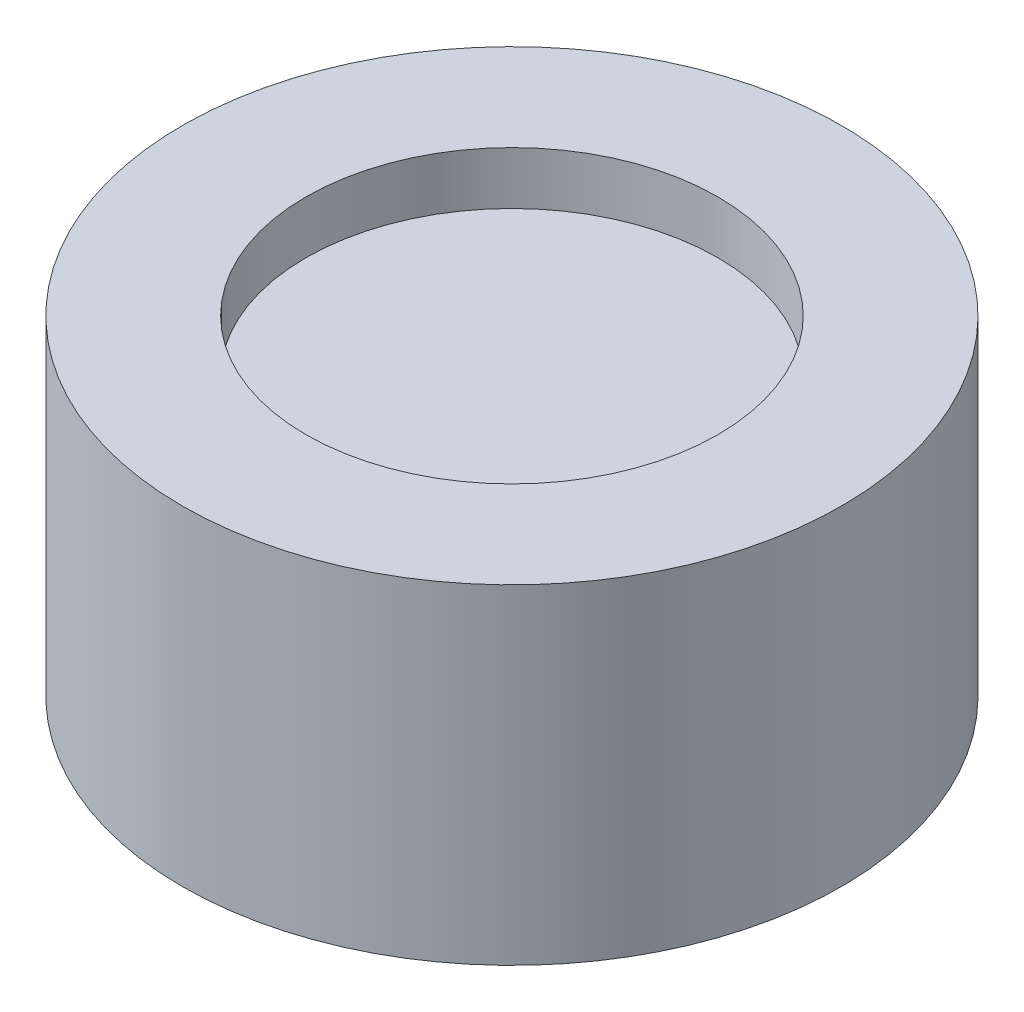
ISO-10303-21;
HEADER;
FILE_DESCRIPTION(('STEP AP214'),'2;1');
FILE_NAME('part.step','',(''),(''),'','','');
FILE_SCHEMA(('AUTOMOTIVE_DESIGN { 1 0 10303 214 1 1 1 1 }'));
ENDSEC;
DATA;
#1=APPLICATION_CONTEXT('core data for automotive mechanical design processes');
#2=APPLICATION_PROTOCOL_DEFINITION('international standard','automotive_design',2000,#1);
#3=PRODUCT_CONTEXT('',#1,'mechanical');
#4=PRODUCT('Part','Part','',(#3));
#5=PRODUCT_RELATED_PRODUCT_CATEGORY('part','',(#4));
#6=PRODUCT_DEFINITION_FORMATION('','',#4);
#7=PRODUCT_DEFINITION_CONTEXT('part definition',#1,'design');
#8=PRODUCT_DEFINITION('design','',#6,#7);
#9=PRODUCT_DEFINITION_SHAPE('','',#8);
#10=(LENGTH_UNIT() NAMED_UNIT(*) SI_UNIT(.MILLI.,.METRE.));
#11=(NAMED_UNIT(*) PLANE_ANGLE_UNIT() SI_UNIT($,.RADIAN.));
#12=(NAMED_UNIT(*) SI_UNIT($,.STERADIAN.) SOLID_ANGLE_UNIT());
#13=UNCERTAINTY_MEASURE_WITH_UNIT(LENGTH_MEASURE(1.E-05),#10,'distance_accuracy_value','');
#14=(GEOMETRIC_REPRESENTATION_CONTEXT(3) GLOBAL_UNCERTAINTY_ASSIGNED_CONTEXT((#13)) GLOBAL_UNIT_ASSIGNED_CONTEXT((#10,
#11,#12)) REPRESENTATION_CONTEXT('',''));
#15=CARTESIAN_POINT('',(0.,0.,0.));
#16=DIRECTION('',(0.,0.,1.));
#17=DIRECTION('',(1.,0.,0.));
#18=AXIS2_PLACEMENT_3D('',#15,#16,#17);
#19=CARTESIAN_POINT('',(0.,6.35,0.));
#20=DIRECTION('',(0.,-1.,0.));
#21=DIRECTION('',(0.,0.,-1.));
#22=AXIS2_PLACEMENT_3D('',#19,#20,#21);
#23=CYLINDRICAL_SURFACE('',#22,6.35);
#24=CARTESIAN_POINT('',(0.,6.35,0.));
#25=DIRECTION('',(0.,1.,0.));
#26=DIRECTION('',(0.,0.,1.));
#27=AXIS2_PLACEMENT_3D('',#24,#25,#26);
#28=CIRCLE('',#27,6.35);
#29=CARTESIAN_POINT('',(0.,6.35,6.35));
#30=VERTEX_POINT('',#29);
#31=EDGE_CURVE('E11',#30,#30,#28,.T.);
#32=ORIENTED_EDGE('',*,*,#31,.F.);
#33=EDGE_LOOP('',(#32));
#34=FACE_BOUND('',#33,.T.);
#35=CARTESIAN_POINT('',(0.,0.,0.));
#36=DIRECTION('',(0.,1.,0.));
#37=DIRECTION('',(0.,0.,1.));
#38=AXIS2_PLACEMENT_3D('',#35,#36,#37);
#39=CIRCLE('',#38,6.35);
#40=CARTESIAN_POINT('',(0.,0.,6.35));
#41=VERTEX_POINT('',#40);
#42=EDGE_CURVE('E37',#41,#41,#39,.T.);
#43=ORIENTED_EDGE('',*,*,#42,.T.);
#44=EDGE_LOOP('',(#43));
#45=FACE_BOUND('',#44,.T.);
#46=ADVANCED_FACE('F34',(#34,#45),#23,.T.);
#47=CARTESIAN_POINT('',(0.,6.35,0.));
#48=DIRECTION('',(0.,1.,0.));
#49=DIRECTION('',(0.,0.,1.));
#50=AXIS2_PLACEMENT_3D('',#47,#48,#49);
#51=PLANE('',#50);
#52=CARTESIAN_POINT('',(0.,6.35,0.));
#53=DIRECTION('',(0.,1.,0.));
#54=DIRECTION('',(0.,0.,1.));
#55=AXIS2_PLACEMENT_3D('',#52,#53,#54);
#56=CIRCLE('',#55,3.96875);
#57=CARTESIAN_POINT('',(0.,6.35,3.96875));
#58=VERTEX_POINT('',#57);
#59=EDGE_CURVE('E53',#58,#58,#56,.T.);
#60=ORIENTED_EDGE('',*,*,#59,.F.);
#61=EDGE_LOOP('',(#60));
#62=FACE_BOUND('',#61,.T.);
#63=ORIENTED_EDGE('',*,*,#31,.T.);
#64=EDGE_LOOP('',(#63));
#65=FACE_BOUND('',#64,.T.);
#66=ADVANCED_FACE('F72',(#62,#65),#51,.T.);
#67=CARTESIAN_POINT('',(0.,0.,0.));
#68=DIRECTION('',(0.,1.,0.));
#69=DIRECTION('',(0.,0.,1.));
#70=AXIS2_PLACEMENT_3D('',#67,#68,#69);
#71=PLANE('',#70);
#72=CARTESIAN_POINT('',(0.,0.,0.));
#73=DIRECTION('',(0.,-1.,0.));
#74=DIRECTION('',(0.,0.,-1.));
#75=AXIS2_PLACEMENT_3D('',#72,#73,#74);
#76=CIRCLE('',#75,1.13029999999999);
#77=CARTESIAN_POINT('',(0.,0.,-1.13029999999999));
#78=VERTEX_POINT('',#77);
#79=EDGE_CURVE('E54',#78,#78,#76,.T.);
#80=ORIENTED_EDGE('',*,*,#79,.F.);
#81=EDGE_LOOP('',(#80));
#82=FACE_BOUND('',#81,.T.);
#83=ORIENTED_EDGE('',*,*,#42,.F.);
#84=EDGE_LOOP('',(#83));
#85=FACE_BOUND('',#84,.T.);
#86=ADVANCED_FACE('F69',(#82,#85),#71,.F.);
#87=CARTESIAN_POINT('',(0.,5.334,0.));
#88=DIRECTION('',(0.,1.,0.));
#89=DIRECTION('',(0.,0.,1.));
#90=AXIS2_PLACEMENT_3D('',#87,#88,#89);
#91=CYLINDRICAL_SURFACE('',#90,3.96875);
#92=CARTESIAN_POINT('',(0.,5.334,0.));
#93=DIRECTION('',(0.,1.,0.));
#94=DIRECTION('',(0.,0.,1.));
#95=AXIS2_PLACEMENT_3D('',#92,#93,#94);
#96=CIRCLE('',#95,3.96875);
#97=CARTESIAN_POINT('',(0.,5.334,3.96875));
#98=VERTEX_POINT('',#97);
#99=EDGE_CURVE('E57',#98,#98,#96,.T.);
#100=ORIENTED_EDGE('',*,*,#99,.F.);
#101=EDGE_LOOP('',(#100));
#102=FACE_BOUND('',#101,.T.);
#103=ORIENTED_EDGE('',*,*,#59,.T.);
#104=EDGE_LOOP('',(#103));
#105=FACE_BOUND('',#104,.T.);
#106=ADVANCED_FACE('F71',(#102,#105),#91,.F.);
#107=CARTESIAN_POINT('',(0.,5.334,0.));
#108=DIRECTION('',(0.,1.,0.));
#109=DIRECTION('',(0.,0.,1.));
#110=AXIS2_PLACEMENT_3D('',#107,#108,#109);
#111=PLANE('',#110);
#112=ORIENTED_EDGE('',*,*,#99,.T.);
#113=EDGE_LOOP('',(#112));
#114=FACE_BOUND('',#113,.T.);
#115=ADVANCED_FACE('F47',(#114),#111,.T.);
#116=CARTESIAN_POINT('',(0.,2.032,0.));
#117=DIRECTION('',(0.,-1.,0.));
#118=DIRECTION('',(0.,0.,-1.));
#119=AXIS2_PLACEMENT_3D('',#116,#117,#118);
#120=CONICAL_SURFACE('',#119,1.1303,1.02974425867665);
#121=CARTESIAN_POINT('',(0.,2.71115275768685,0.));
#122=VERTEX_POINT('',#121);
#123=VERTEX_LOOP('',#122);
#124=FACE_BOUND('',#123,.T.);
#125=CARTESIAN_POINT('',(0.,2.032,0.));
#126=DIRECTION('',(0.,-1.,0.));
#127=DIRECTION('',(0.,0.,-1.));
#128=AXIS2_PLACEMENT_3D('',#125,#126,#127);
#129=CIRCLE('',#128,1.1303);
#130=CARTESIAN_POINT('',(0.,2.032,-1.1303));
#131=VERTEX_POINT('',#130);
#132=EDGE_CURVE('E51',#131,#131,#129,.T.);
#133=ORIENTED_EDGE('',*,*,#132,.T.);
#134=EDGE_LOOP('',(#133));
#135=FACE_BOUND('',#134,.T.);
#136=ADVANCED_FACE('F43',(#124,#135),#120,.F.);
#137=CARTESIAN_POINT('',(0.,0.,0.));
#138=DIRECTION('',(0.,-1.,0.));
#139=DIRECTION('',(0.,0.,-1.));
#140=AXIS2_PLACEMENT_3D('',#137,#138,#139);
#141=CYLINDRICAL_SURFACE('',#140,1.13029999999999);
#142=ORIENTED_EDGE('',*,*,#132,.F.);
#143=EDGE_LOOP('',(#142));
#144=FACE_BOUND('',#143,.T.);
#145=ORIENTED_EDGE('',*,*,#79,.T.);
#146=EDGE_LOOP('',(#145));
#147=FACE_BOUND('',#146,.T.);
#148=ADVANCED_FACE('F46',(#144,#147),#141,.F.);
#149=CLOSED_SHELL('',(#46,#66,#86,#106,#115,#136,#148));
#150=MANIFOLD_SOLID_BREP('B2',#149);
#151=ADVANCED_BREP_SHAPE_REPRESENTATION('',(#18,#150),#14);
#152=SHAPE_DEFINITION_REPRESENTATION(#9,#151);
ENDSEC;
END-ISO-10303-21;
